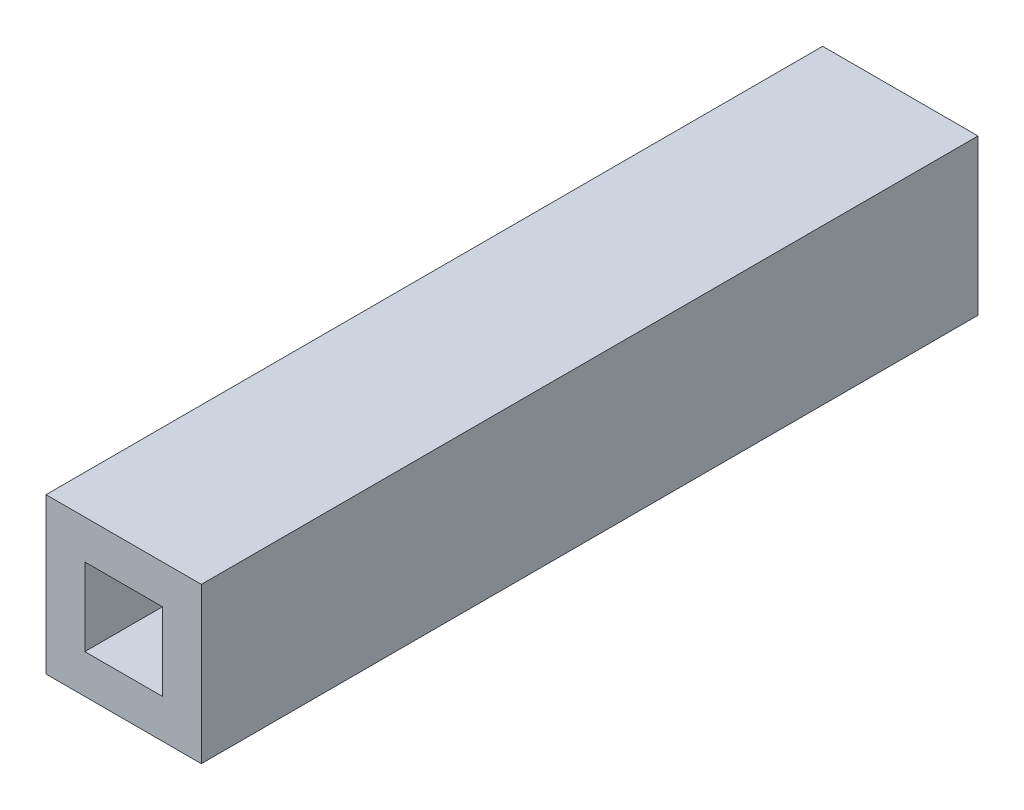
ISO-10303-21;
HEADER;
FILE_DESCRIPTION(('STEP AP214'),'2;1');
FILE_NAME('part.step','',(''),(''),'','','');
FILE_SCHEMA(('AUTOMOTIVE_DESIGN { 1 0 10303 214 1 1 1 1 }'));
ENDSEC;
DATA;
#1=APPLICATION_CONTEXT('core data for automotive mechanical design processes');
#2=APPLICATION_PROTOCOL_DEFINITION('international standard','automotive_design',2000,#1);
#3=PRODUCT_CONTEXT('',#1,'mechanical');
#4=PRODUCT('Part','Part','',(#3));
#5=PRODUCT_RELATED_PRODUCT_CATEGORY('part','',(#4));
#6=PRODUCT_DEFINITION_FORMATION('','',#4);
#7=PRODUCT_DEFINITION_CONTEXT('part definition',#1,'design');
#8=PRODUCT_DEFINITION('design','',#6,#7);
#9=PRODUCT_DEFINITION_SHAPE('','',#8);
#10=(LENGTH_UNIT() NAMED_UNIT(*) SI_UNIT(.MILLI.,.METRE.));
#11=(NAMED_UNIT(*) PLANE_ANGLE_UNIT() SI_UNIT($,.RADIAN.));
#12=(NAMED_UNIT(*) SI_UNIT($,.STERADIAN.) SOLID_ANGLE_UNIT());
#13=UNCERTAINTY_MEASURE_WITH_UNIT(LENGTH_MEASURE(1.E-05),#10,'distance_accuracy_value','');
#14=(GEOMETRIC_REPRESENTATION_CONTEXT(3) GLOBAL_UNCERTAINTY_ASSIGNED_CONTEXT((#13)) GLOBAL_UNIT_ASSIGNED_CONTEXT((#10,
#11,#12)) REPRESENTATION_CONTEXT('',''));
#15=CARTESIAN_POINT('',(0.,0.,0.));
#16=DIRECTION('',(0.,0.,1.));
#17=DIRECTION('',(1.,0.,0.));
#18=AXIS2_PLACEMENT_3D('',#15,#16,#17);
#19=CARTESIAN_POINT('',(0.,0.,100.));
#20=DIRECTION('',(0.,0.,1.));
#21=DIRECTION('',(1.,0.,0.));
#22=AXIS2_PLACEMENT_3D('',#19,#20,#21);
#23=PLANE('',#22);
#24=DIRECTION('',(0.,1.,0.));
#25=VECTOR('',#24,1.);
#26=CARTESIAN_POINT('',(10.,-10.,100.));
#27=LINE('',#26,#25);
#28=CARTESIAN_POINT('',(10.,-10.,100.));
#29=VERTEX_POINT('',#28);
#30=CARTESIAN_POINT('',(10.,10.,100.));
#31=VERTEX_POINT('',#30);
#32=EDGE_CURVE('E158',#29,#31,#27,.T.);
#33=ORIENTED_EDGE('',*,*,#32,.T.);
#34=DIRECTION('',(-1.,0.,0.));
#35=VECTOR('',#34,1.);
#36=CARTESIAN_POINT('',(-10.,10.,100.));
#37=LINE('',#36,#35);
#38=CARTESIAN_POINT('',(-10.,10.,100.));
#39=VERTEX_POINT('',#38);
#40=EDGE_CURVE('E161',#31,#39,#37,.T.);
#41=ORIENTED_EDGE('',*,*,#40,.T.);
#42=DIRECTION('',(0.,-1.,0.));
#43=VECTOR('',#42,1.);
#44=CARTESIAN_POINT('',(-10.,-10.,100.));
#45=LINE('',#44,#43);
#46=CARTESIAN_POINT('',(-10.,-10.,100.));
#47=VERTEX_POINT('',#46);
#48=EDGE_CURVE('E164',#39,#47,#45,.T.);
#49=ORIENTED_EDGE('',*,*,#48,.T.);
#50=DIRECTION('',(1.,0.,0.));
#51=VECTOR('',#50,1.);
#52=CARTESIAN_POINT('',(-10.,-10.,100.));
#53=LINE('',#52,#51);
#54=EDGE_CURVE('E166',#47,#29,#53,.T.);
#55=ORIENTED_EDGE('',*,*,#54,.T.);
#56=EDGE_LOOP('',(#33,#41,#49,#55));
#57=FACE_BOUND('',#56,.T.);
#58=DIRECTION('',(-1.,0.,0.));
#59=VECTOR('',#58,1.);
#60=CARTESIAN_POINT('',(0.,5.,100.));
#61=LINE('',#60,#59);
#62=CARTESIAN_POINT('',(5.,5.,100.));
#63=VERTEX_POINT('',#62);
#64=CARTESIAN_POINT('',(-5.,5.,100.));
#65=VERTEX_POINT('',#64);
#66=EDGE_CURVE('E130',#63,#65,#61,.T.);
#67=ORIENTED_EDGE('',*,*,#66,.F.);
#68=DIRECTION('',(0.,1.,0.));
#69=VECTOR('',#68,1.);
#70=CARTESIAN_POINT('',(5.,0.,100.));
#71=LINE('',#70,#69);
#72=CARTESIAN_POINT('',(5.,-5.,100.));
#73=VERTEX_POINT('',#72);
#74=EDGE_CURVE('E122',#73,#63,#71,.T.);
#75=ORIENTED_EDGE('',*,*,#74,.F.);
#76=DIRECTION('',(1.,0.,0.));
#77=VECTOR('',#76,1.);
#78=CARTESIAN_POINT('',(0.,-5.,100.));
#79=LINE('',#78,#77);
#80=CARTESIAN_POINT('',(-5.,-5.,100.));
#81=VERTEX_POINT('',#80);
#82=EDGE_CURVE('E144',#81,#73,#79,.T.);
#83=ORIENTED_EDGE('',*,*,#82,.F.);
#84=DIRECTION('',(0.,-1.,0.));
#85=VECTOR('',#84,1.);
#86=CARTESIAN_POINT('',(-5.,0.,100.));
#87=LINE('',#86,#85);
#88=EDGE_CURVE('E142',#65,#81,#87,.T.);
#89=ORIENTED_EDGE('',*,*,#88,.F.);
#90=EDGE_LOOP('',(#67,#75,#83,#89));
#91=FACE_BOUND('',#90,.T.);
#92=ADVANCED_FACE('F57',(#57,#91),#23,.T.);
#93=CARTESIAN_POINT('',(0.,0.,0.));
#94=DIRECTION('',(0.,0.,1.));
#95=DIRECTION('',(1.,0.,0.));
#96=AXIS2_PLACEMENT_3D('',#93,#94,#95);
#97=PLANE('',#96);
#98=DIRECTION('',(0.,1.,0.));
#99=VECTOR('',#98,1.);
#100=CARTESIAN_POINT('',(10.,-10.,0.));
#101=LINE('',#100,#99);
#102=CARTESIAN_POINT('',(10.,-10.,0.));
#103=VERTEX_POINT('',#102);
#104=CARTESIAN_POINT('',(10.,10.,0.));
#105=VERTEX_POINT('',#104);
#106=EDGE_CURVE('E138',#103,#105,#101,.T.);
#107=ORIENTED_EDGE('',*,*,#106,.F.);
#108=DIRECTION('',(1.,0.,0.));
#109=VECTOR('',#108,1.);
#110=CARTESIAN_POINT('',(-10.,-10.,0.));
#111=LINE('',#110,#109);
#112=CARTESIAN_POINT('',(-10.,-10.,0.));
#113=VERTEX_POINT('',#112);
#114=EDGE_CURVE('E162',#113,#103,#111,.T.);
#115=ORIENTED_EDGE('',*,*,#114,.F.);
#116=DIRECTION('',(0.,-1.,0.));
#117=VECTOR('',#116,1.);
#118=CARTESIAN_POINT('',(-10.,-10.,0.));
#119=LINE('',#118,#117);
#120=CARTESIAN_POINT('',(-10.,10.,0.));
#121=VERTEX_POINT('',#120);
#122=EDGE_CURVE('E173',#121,#113,#119,.T.);
#123=ORIENTED_EDGE('',*,*,#122,.F.);
#124=DIRECTION('',(-1.,0.,0.));
#125=VECTOR('',#124,1.);
#126=CARTESIAN_POINT('',(-10.,10.,0.));
#127=LINE('',#126,#125);
#128=EDGE_CURVE('E171',#105,#121,#127,.T.);
#129=ORIENTED_EDGE('',*,*,#128,.F.);
#130=EDGE_LOOP('',(#107,#115,#123,#129));
#131=FACE_BOUND('',#130,.T.);
#132=DIRECTION('',(0.,1.,0.));
#133=VECTOR('',#132,1.);
#134=CARTESIAN_POINT('',(5.,0.,0.));
#135=LINE('',#134,#133);
#136=CARTESIAN_POINT('',(5.,-5.,0.));
#137=VERTEX_POINT('',#136);
#138=CARTESIAN_POINT('',(5.,5.,0.));
#139=VERTEX_POINT('',#138);
#140=EDGE_CURVE('E80',#137,#139,#135,.T.);
#141=ORIENTED_EDGE('',*,*,#140,.T.);
#142=DIRECTION('',(-1.,0.,0.));
#143=VECTOR('',#142,1.);
#144=CARTESIAN_POINT('',(0.,5.,0.));
#145=LINE('',#144,#143);
#146=CARTESIAN_POINT('',(-5.,5.,0.));
#147=VERTEX_POINT('',#146);
#148=EDGE_CURVE('E137',#139,#147,#145,.T.);
#149=ORIENTED_EDGE('',*,*,#148,.T.);
#150=DIRECTION('',(0.,-1.,0.));
#151=VECTOR('',#150,1.);
#152=CARTESIAN_POINT('',(-5.,0.,0.));
#153=LINE('',#152,#151);
#154=CARTESIAN_POINT('',(-5.,-5.,0.));
#155=VERTEX_POINT('',#154);
#156=EDGE_CURVE('E150',#147,#155,#153,.T.);
#157=ORIENTED_EDGE('',*,*,#156,.T.);
#158=DIRECTION('',(1.,0.,0.));
#159=VECTOR('',#158,1.);
#160=CARTESIAN_POINT('',(0.,-5.,0.));
#161=LINE('',#160,#159);
#162=EDGE_CURVE('E131',#155,#137,#161,.T.);
#163=ORIENTED_EDGE('',*,*,#162,.T.);
#164=EDGE_LOOP('',(#141,#149,#157,#163));
#165=FACE_BOUND('',#164,.T.);
#166=ADVANCED_FACE('F191',(#131,#165),#97,.F.);
#167=CARTESIAN_POINT('',(10.,-10.,100.));
#168=DIRECTION('',(-1.,0.,0.));
#169=DIRECTION('',(0.,0.,1.));
#170=AXIS2_PLACEMENT_3D('',#167,#168,#169);
#171=PLANE('',#170);
#172=ORIENTED_EDGE('',*,*,#106,.T.);
#173=DIRECTION('',(0.,0.,-1.));
#174=VECTOR('',#173,1.);
#175=CARTESIAN_POINT('',(10.,10.,100.));
#176=LINE('',#175,#174);
#177=EDGE_CURVE('E12',#31,#105,#176,.T.);
#178=ORIENTED_EDGE('',*,*,#177,.F.);
#179=ORIENTED_EDGE('',*,*,#32,.F.);
#180=DIRECTION('',(0.,0.,-1.));
#181=VECTOR('',#180,1.);
#182=CARTESIAN_POINT('',(10.,-10.,100.));
#183=LINE('',#182,#181);
#184=EDGE_CURVE('E168',#29,#103,#183,.T.);
#185=ORIENTED_EDGE('',*,*,#184,.T.);
#186=EDGE_LOOP('',(#172,#178,#179,#185));
#187=FACE_BOUND('',#186,.T.);
#188=ADVANCED_FACE('F59',(#187),#171,.F.);
#189=CARTESIAN_POINT('',(-10.,10.,100.));
#190=DIRECTION('',(0.,-1.,0.));
#191=DIRECTION('',(0.,0.,-1.));
#192=AXIS2_PLACEMENT_3D('',#189,#190,#191);
#193=PLANE('',#192);
#194=ORIENTED_EDGE('',*,*,#128,.T.);
#195=DIRECTION('',(0.,0.,-1.));
#196=VECTOR('',#195,1.);
#197=CARTESIAN_POINT('',(-10.,10.,100.));
#198=LINE('',#197,#196);
#199=EDGE_CURVE('E65',#39,#121,#198,.T.);
#200=ORIENTED_EDGE('',*,*,#199,.F.);
#201=ORIENTED_EDGE('',*,*,#40,.F.);
#202=ORIENTED_EDGE('',*,*,#177,.T.);
#203=EDGE_LOOP('',(#194,#200,#201,#202));
#204=FACE_BOUND('',#203,.T.);
#205=ADVANCED_FACE('F201',(#204),#193,.F.);
#206=CARTESIAN_POINT('',(-10.,-10.,100.));
#207=DIRECTION('',(1.,0.,0.));
#208=DIRECTION('',(0.,0.,-1.));
#209=AXIS2_PLACEMENT_3D('',#206,#207,#208);
#210=PLANE('',#209);
#211=ORIENTED_EDGE('',*,*,#122,.T.);
#212=DIRECTION('',(0.,0.,-1.));
#213=VECTOR('',#212,1.);
#214=CARTESIAN_POINT('',(-10.,-10.,100.));
#215=LINE('',#214,#213);
#216=EDGE_CURVE('E178',#47,#113,#215,.T.);
#217=ORIENTED_EDGE('',*,*,#216,.F.);
#218=ORIENTED_EDGE('',*,*,#48,.F.);
#219=ORIENTED_EDGE('',*,*,#199,.T.);
#220=EDGE_LOOP('',(#211,#217,#218,#219));
#221=FACE_BOUND('',#220,.T.);
#222=ADVANCED_FACE('F185',(#221),#210,.F.);
#223=CARTESIAN_POINT('',(-10.,-10.,100.));
#224=DIRECTION('',(0.,1.,0.));
#225=DIRECTION('',(0.,0.,1.));
#226=AXIS2_PLACEMENT_3D('',#223,#224,#225);
#227=PLANE('',#226);
#228=ORIENTED_EDGE('',*,*,#114,.T.);
#229=ORIENTED_EDGE('',*,*,#184,.F.);
#230=ORIENTED_EDGE('',*,*,#54,.F.);
#231=ORIENTED_EDGE('',*,*,#216,.T.);
#232=EDGE_LOOP('',(#228,#229,#230,#231));
#233=FACE_BOUND('',#232,.T.);
#234=ADVANCED_FACE('F195',(#233),#227,.F.);
#235=CARTESIAN_POINT('',(5.,0.,100.));
#236=DIRECTION('',(-1.,0.,0.));
#237=DIRECTION('',(0.,0.,1.));
#238=AXIS2_PLACEMENT_3D('',#235,#236,#237);
#239=PLANE('',#238);
#240=ORIENTED_EDGE('',*,*,#140,.F.);
#241=DIRECTION('',(0.,0.,-1.));
#242=VECTOR('',#241,1.);
#243=CARTESIAN_POINT('',(5.,-5.,100.));
#244=LINE('',#243,#242);
#245=EDGE_CURVE('E126',#73,#137,#244,.T.);
#246=ORIENTED_EDGE('',*,*,#245,.F.);
#247=ORIENTED_EDGE('',*,*,#74,.T.);
#248=DIRECTION('',(0.,0.,-1.));
#249=VECTOR('',#248,1.);
#250=CARTESIAN_POINT('',(5.,5.,100.));
#251=LINE('',#250,#249);
#252=EDGE_CURVE('E125',#63,#139,#251,.T.);
#253=ORIENTED_EDGE('',*,*,#252,.T.);
#254=EDGE_LOOP('',(#240,#246,#247,#253));
#255=FACE_BOUND('',#254,.T.);
#256=ADVANCED_FACE('F124',(#255),#239,.T.);
#257=CARTESIAN_POINT('',(0.,5.,100.));
#258=DIRECTION('',(0.,-1.,0.));
#259=DIRECTION('',(0.,0.,-1.));
#260=AXIS2_PLACEMENT_3D('',#257,#258,#259);
#261=PLANE('',#260);
#262=ORIENTED_EDGE('',*,*,#148,.F.);
#263=ORIENTED_EDGE('',*,*,#252,.F.);
#264=ORIENTED_EDGE('',*,*,#66,.T.);
#265=DIRECTION('',(0.,0.,-1.));
#266=VECTOR('',#265,1.);
#267=CARTESIAN_POINT('',(-5.,5.,100.));
#268=LINE('',#267,#266);
#269=EDGE_CURVE('E139',#65,#147,#268,.T.);
#270=ORIENTED_EDGE('',*,*,#269,.T.);
#271=EDGE_LOOP('',(#262,#263,#264,#270));
#272=FACE_BOUND('',#271,.T.);
#273=ADVANCED_FACE('F134',(#272),#261,.T.);
#274=CARTESIAN_POINT('',(-5.,0.,100.));
#275=DIRECTION('',(1.,0.,0.));
#276=DIRECTION('',(0.,0.,-1.));
#277=AXIS2_PLACEMENT_3D('',#274,#275,#276);
#278=PLANE('',#277);
#279=ORIENTED_EDGE('',*,*,#156,.F.);
#280=ORIENTED_EDGE('',*,*,#269,.F.);
#281=ORIENTED_EDGE('',*,*,#88,.T.);
#282=DIRECTION('',(0.,0.,-1.));
#283=VECTOR('',#282,1.);
#284=CARTESIAN_POINT('',(-5.,-5.,100.));
#285=LINE('',#284,#283);
#286=EDGE_CURVE('E72',#81,#155,#285,.T.);
#287=ORIENTED_EDGE('',*,*,#286,.T.);
#288=EDGE_LOOP('',(#279,#280,#281,#287));
#289=FACE_BOUND('',#288,.T.);
#290=ADVANCED_FACE('F224',(#289),#278,.T.);
#291=CARTESIAN_POINT('',(0.,-5.,100.));
#292=DIRECTION('',(0.,1.,0.));
#293=DIRECTION('',(0.,0.,1.));
#294=AXIS2_PLACEMENT_3D('',#291,#292,#293);
#295=PLANE('',#294);
#296=ORIENTED_EDGE('',*,*,#162,.F.);
#297=ORIENTED_EDGE('',*,*,#286,.F.);
#298=ORIENTED_EDGE('',*,*,#82,.T.);
#299=ORIENTED_EDGE('',*,*,#245,.T.);
#300=EDGE_LOOP('',(#296,#297,#298,#299));
#301=FACE_BOUND('',#300,.T.);
#302=ADVANCED_FACE('F228',(#301),#295,.T.);
#303=CLOSED_SHELL('',(#92,#166,#188,#205,#222,#234,#256,#273,#290,#302));
#304=MANIFOLD_SOLID_BREP('B2',#303);
#305=ADVANCED_BREP_SHAPE_REPRESENTATION('',(#18,#304),#14);
#306=SHAPE_DEFINITION_REPRESENTATION(#9,#305);
ENDSEC;
END-ISO-10303-21;
